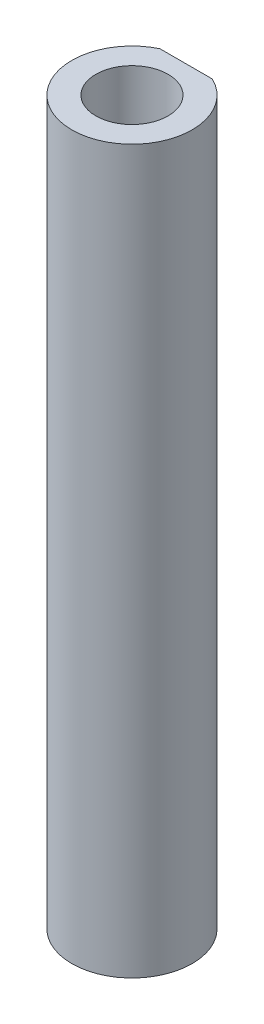
ISO-10303-21;
HEADER;
FILE_DESCRIPTION(('STEP AP214'),'2;1');
FILE_NAME('part.step','',(''),(''),'','','');
FILE_SCHEMA(('AUTOMOTIVE_DESIGN { 1 0 10303 214 1 1 1 1 }'));
ENDSEC;
DATA;
#1=APPLICATION_CONTEXT('core data for automotive mechanical design processes');
#2=APPLICATION_PROTOCOL_DEFINITION('international standard','automotive_design',2000,#1);
#3=PRODUCT_CONTEXT('',#1,'mechanical');
#4=PRODUCT('Part','Part','',(#3));
#5=PRODUCT_RELATED_PRODUCT_CATEGORY('part','',(#4));
#6=PRODUCT_DEFINITION_FORMATION('','',#4);
#7=PRODUCT_DEFINITION_CONTEXT('part definition',#1,'design');
#8=PRODUCT_DEFINITION('design','',#6,#7);
#9=PRODUCT_DEFINITION_SHAPE('','',#8);
#10=(LENGTH_UNIT() NAMED_UNIT(*) SI_UNIT(.MILLI.,.METRE.));
#11=(NAMED_UNIT(*) PLANE_ANGLE_UNIT() SI_UNIT($,.RADIAN.));
#12=(NAMED_UNIT(*) SI_UNIT($,.STERADIAN.) SOLID_ANGLE_UNIT());
#13=UNCERTAINTY_MEASURE_WITH_UNIT(LENGTH_MEASURE(1.E-05),#10,'distance_accuracy_value','');
#14=(GEOMETRIC_REPRESENTATION_CONTEXT(3) GLOBAL_UNCERTAINTY_ASSIGNED_CONTEXT((#13)) GLOBAL_UNIT_ASSIGNED_CONTEXT((#10,
#11,#12)) REPRESENTATION_CONTEXT('',''));
#15=CARTESIAN_POINT('',(0.,0.,0.));
#16=DIRECTION('',(0.,0.,1.));
#17=DIRECTION('',(1.,0.,0.));
#18=AXIS2_PLACEMENT_3D('',#15,#16,#17);
#19=CARTESIAN_POINT('',(0.,-30.,0.));
#20=DIRECTION('',(0.,1.,0.));
#21=DIRECTION('',(0.,0.,1.));
#22=AXIS2_PLACEMENT_3D('',#19,#20,#21);
#23=PLANE('',#22);
#24=CARTESIAN_POINT('',(0.,-30.,0.));
#25=DIRECTION('',(0.,1.,0.));
#26=DIRECTION('',(0.,0.,1.));
#27=AXIS2_PLACEMENT_3D('',#24,#25,#26);
#28=CIRCLE('',#27,3.);
#29=CARTESIAN_POINT('',(0.,-30.,3.));
#30=VERTEX_POINT('',#29);
#31=EDGE_CURVE('E99',#30,#30,#28,.T.);
#32=ORIENTED_EDGE('',*,*,#31,.T.);
#33=EDGE_LOOP('',(#32));
#34=FACE_BOUND('',#33,.T.);
#35=DIRECTION('',(1.,0.,0.));
#36=VECTOR('',#35,1.);
#37=CARTESIAN_POINT('',(2.17944947177034,-30.,-4.5));
#38=LINE('',#37,#36);
#39=CARTESIAN_POINT('',(-2.17944947177034,-30.,-4.5));
#40=VERTEX_POINT('',#39);
#41=CARTESIAN_POINT('',(2.17944947177034,-30.,-4.5));
#42=VERTEX_POINT('',#41);
#43=EDGE_CURVE('E82',#40,#42,#38,.T.);
#44=ORIENTED_EDGE('',*,*,#43,.T.);
#45=CARTESIAN_POINT('',(0.,-30.,0.));
#46=DIRECTION('',(0.,1.,0.));
#47=DIRECTION('',(0.,0.,1.));
#48=AXIS2_PLACEMENT_3D('',#45,#46,#47);
#49=CIRCLE('',#48,5.);
#50=EDGE_CURVE('E36',#40,#42,#49,.T.);
#51=ORIENTED_EDGE('',*,*,#50,.F.);
#52=EDGE_LOOP('',(#44,#51));
#53=FACE_BOUND('',#52,.T.);
#54=ADVANCED_FACE('F32',(#34,#53),#23,.F.);
#55=CARTESIAN_POINT('',(0.,30.,0.));
#56=DIRECTION('',(0.,-1.,0.));
#57=DIRECTION('',(0.,0.,-1.));
#58=AXIS2_PLACEMENT_3D('',#55,#56,#57);
#59=CYLINDRICAL_SURFACE('',#58,5.);
#60=CARTESIAN_POINT('',(0.,30.,0.));
#61=DIRECTION('',(0.,1.,0.));
#62=DIRECTION('',(0.,0.,1.));
#63=AXIS2_PLACEMENT_3D('',#60,#61,#62);
#64=CIRCLE('',#63,5.);
#65=CARTESIAN_POINT('',(-2.17944947177034,30.,-4.5));
#66=VERTEX_POINT('',#65);
#67=CARTESIAN_POINT('',(2.17944947177034,30.,-4.5));
#68=VERTEX_POINT('',#67);
#69=EDGE_CURVE('E11',#66,#68,#64,.T.);
#70=ORIENTED_EDGE('',*,*,#69,.F.);
#71=DIRECTION('',(0.,1.,0.));
#72=VECTOR('',#71,1.);
#73=CARTESIAN_POINT('',(-2.17944947177034,20.,-4.5));
#74=LINE('',#73,#72);
#75=CARTESIAN_POINT('',(-2.17944947177034,20.,-4.5));
#76=VERTEX_POINT('',#75);
#77=EDGE_CURVE('E94',#76,#66,#74,.T.);
#78=ORIENTED_EDGE('',*,*,#77,.F.);
#79=CARTESIAN_POINT('',(0.,20.,0.));
#80=DIRECTION('',(0.,1.,0.));
#81=DIRECTION('',(0.,0.,1.));
#82=AXIS2_PLACEMENT_3D('',#79,#80,#81);
#83=CIRCLE('',#82,5.);
#84=CARTESIAN_POINT('',(2.17944947177034,20.,-4.5));
#85=VERTEX_POINT('',#84);
#86=EDGE_CURVE('E91',#85,#76,#83,.T.);
#87=ORIENTED_EDGE('',*,*,#86,.F.);
#88=DIRECTION('',(0.,1.,0.));
#89=VECTOR('',#88,1.);
#90=CARTESIAN_POINT('',(2.17944947177034,20.,-4.5));
#91=LINE('',#90,#89);
#92=EDGE_CURVE('E96',#85,#68,#91,.T.);
#93=ORIENTED_EDGE('',*,*,#92,.T.);
#94=EDGE_LOOP('',(#70,#78,#87,#93));
#95=FACE_BOUND('',#94,.T.);
#96=DIRECTION('',(0.,-1.,0.));
#97=VECTOR('',#96,1.);
#98=CARTESIAN_POINT('',(2.17944947177034,-20.,-4.5));
#99=LINE('',#98,#97);
#100=CARTESIAN_POINT('',(2.17944947177034,-20.,-4.5));
#101=VERTEX_POINT('',#100);
#102=EDGE_CURVE('E74',#101,#42,#99,.T.);
#103=ORIENTED_EDGE('',*,*,#102,.F.);
#104=CARTESIAN_POINT('',(0.,-20.,0.));
#105=DIRECTION('',(0.,1.,0.));
#106=DIRECTION('',(0.,0.,1.));
#107=AXIS2_PLACEMENT_3D('',#104,#105,#106);
#108=CIRCLE('',#107,5.);
#109=CARTESIAN_POINT('',(-2.17944947177034,-20.,-4.5));
#110=VERTEX_POINT('',#109);
#111=EDGE_CURVE('E78',#101,#110,#108,.T.);
#112=ORIENTED_EDGE('',*,*,#111,.T.);
#113=DIRECTION('',(0.,-1.,0.));
#114=VECTOR('',#113,1.);
#115=CARTESIAN_POINT('',(-2.17944947177034,-20.,-4.5));
#116=LINE('',#115,#114);
#117=EDGE_CURVE('E47',#110,#40,#116,.T.);
#118=ORIENTED_EDGE('',*,*,#117,.T.);
#119=ORIENTED_EDGE('',*,*,#50,.T.);
#120=EDGE_LOOP('',(#103,#112,#118,#119));
#121=FACE_BOUND('',#120,.T.);
#122=ADVANCED_FACE('F34',(#95,#121),#59,.T.);
#123=CARTESIAN_POINT('',(0.,30.,0.));
#124=DIRECTION('',(0.,1.,0.));
#125=DIRECTION('',(0.,0.,1.));
#126=AXIS2_PLACEMENT_3D('',#123,#124,#125);
#127=PLANE('',#126);
#128=DIRECTION('',(1.,0.,0.));
#129=VECTOR('',#128,1.);
#130=CARTESIAN_POINT('',(2.17944947177034,30.,-4.5));
#131=LINE('',#130,#129);
#132=EDGE_CURVE('E87',#66,#68,#131,.T.);
#133=ORIENTED_EDGE('',*,*,#132,.F.);
#134=ORIENTED_EDGE('',*,*,#69,.T.);
#135=EDGE_LOOP('',(#133,#134));
#136=FACE_BOUND('',#135,.T.);
#137=CARTESIAN_POINT('',(0.,30.,0.));
#138=DIRECTION('',(0.,1.,0.));
#139=DIRECTION('',(0.,0.,1.));
#140=AXIS2_PLACEMENT_3D('',#137,#138,#139);
#141=CIRCLE('',#140,3.);
#142=CARTESIAN_POINT('',(0.,30.,3.));
#143=VERTEX_POINT('',#142);
#144=EDGE_CURVE('E101',#143,#143,#141,.T.);
#145=ORIENTED_EDGE('',*,*,#144,.F.);
#146=EDGE_LOOP('',(#145));
#147=FACE_BOUND('',#146,.T.);
#148=ADVANCED_FACE('F112',(#136,#147),#127,.T.);
#149=CARTESIAN_POINT('',(0.,30.,0.));
#150=DIRECTION('',(0.,-1.,0.));
#151=DIRECTION('',(0.,0.,-1.));
#152=AXIS2_PLACEMENT_3D('',#149,#150,#151);
#153=CYLINDRICAL_SURFACE('',#152,3.);
#154=ORIENTED_EDGE('',*,*,#144,.T.);
#155=EDGE_LOOP('',(#154));
#156=FACE_BOUND('',#155,.T.);
#157=ORIENTED_EDGE('',*,*,#31,.F.);
#158=EDGE_LOOP('',(#157));
#159=FACE_BOUND('',#158,.T.);
#160=ADVANCED_FACE('F109',(#156,#159),#153,.F.);
#161=CARTESIAN_POINT('',(2.17944947177034,20.,-4.5));
#162=DIRECTION('',(0.,0.,1.));
#163=DIRECTION('',(1.,0.,0.));
#164=AXIS2_PLACEMENT_3D('',#161,#162,#163);
#165=PLANE('',#164);
#166=ORIENTED_EDGE('',*,*,#132,.T.);
#167=ORIENTED_EDGE('',*,*,#92,.F.);
#168=DIRECTION('',(1.,0.,0.));
#169=VECTOR('',#168,1.);
#170=CARTESIAN_POINT('',(2.17944947177034,20.,-4.5));
#171=LINE('',#170,#169);
#172=EDGE_CURVE('E54',#76,#85,#171,.T.);
#173=ORIENTED_EDGE('',*,*,#172,.F.);
#174=ORIENTED_EDGE('',*,*,#77,.T.);
#175=EDGE_LOOP('',(#166,#167,#173,#174));
#176=FACE_BOUND('',#175,.T.);
#177=ADVANCED_FACE('F111',(#176),#165,.F.);
#178=CARTESIAN_POINT('',(0.,20.,0.));
#179=DIRECTION('',(0.,1.,0.));
#180=DIRECTION('',(0.,0.,1.));
#181=AXIS2_PLACEMENT_3D('',#178,#179,#180);
#182=PLANE('',#181);
#183=ORIENTED_EDGE('',*,*,#86,.T.);
#184=ORIENTED_EDGE('',*,*,#172,.T.);
#185=EDGE_LOOP('',(#183,#184));
#186=FACE_BOUND('',#185,.T.);
#187=ADVANCED_FACE('F119',(#186),#182,.T.);
#188=CARTESIAN_POINT('',(2.17944947177034,-20.,-4.5));
#189=DIRECTION('',(0.,0.,-1.));
#190=DIRECTION('',(-1.,0.,0.));
#191=AXIS2_PLACEMENT_3D('',#188,#189,#190);
#192=PLANE('',#191);
#193=ORIENTED_EDGE('',*,*,#43,.F.);
#194=ORIENTED_EDGE('',*,*,#117,.F.);
#195=DIRECTION('',(1.,0.,0.));
#196=VECTOR('',#195,1.);
#197=CARTESIAN_POINT('',(2.17944947177034,-20.,-4.5));
#198=LINE('',#197,#196);
#199=EDGE_CURVE('E70',#110,#101,#198,.T.);
#200=ORIENTED_EDGE('',*,*,#199,.T.);
#201=ORIENTED_EDGE('',*,*,#102,.T.);
#202=EDGE_LOOP('',(#193,#194,#200,#201));
#203=FACE_BOUND('',#202,.T.);
#204=ADVANCED_FACE('F72',(#203),#192,.T.);
#205=CARTESIAN_POINT('',(0.,-20.,0.));
#206=DIRECTION('',(0.,-1.,0.));
#207=DIRECTION('',(0.,0.,1.));
#208=AXIS2_PLACEMENT_3D('',#205,#206,#207);
#209=PLANE('',#208);
#210=ORIENTED_EDGE('',*,*,#111,.F.);
#211=ORIENTED_EDGE('',*,*,#199,.F.);
#212=EDGE_LOOP('',(#210,#211));
#213=FACE_BOUND('',#212,.T.);
#214=ADVANCED_FACE('F80',(#213),#209,.T.);
#215=CLOSED_SHELL('',(#54,#122,#148,#160,#177,#187,#204,#214));
#216=MANIFOLD_SOLID_BREP('B2',#215);
#217=ADVANCED_BREP_SHAPE_REPRESENTATION('',(#18,#216),#14);
#218=SHAPE_DEFINITION_REPRESENTATION(#9,#217);
ENDSEC;
END-ISO-10303-21;
